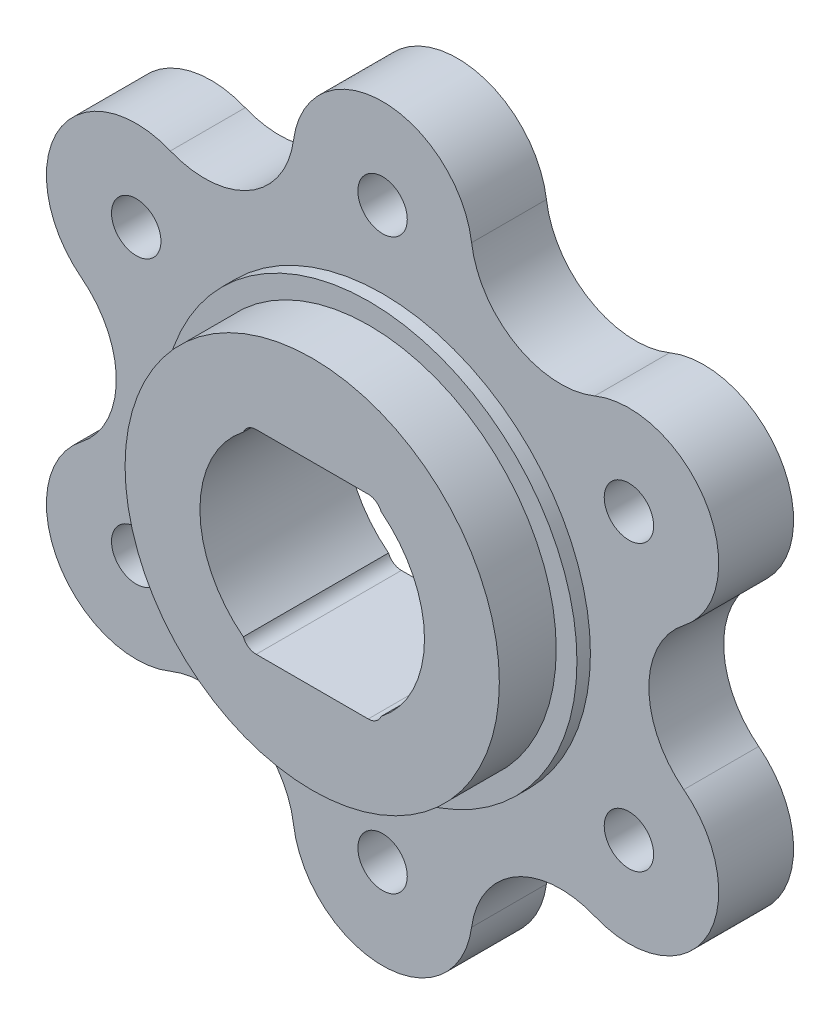
ISO-10303-21;
HEADER;
FILE_DESCRIPTION(('STEP AP214'),'2;1');
FILE_NAME('part.step','',(''),(''),'','','');
FILE_SCHEMA(('AUTOMOTIVE_DESIGN { 1 0 10303 214 1 1 1 1 }'));
ENDSEC;
DATA;
#1=APPLICATION_CONTEXT('core data for automotive mechanical design processes');
#2=APPLICATION_PROTOCOL_DEFINITION('international standard','automotive_design',2000,#1);
#3=PRODUCT_CONTEXT('',#1,'mechanical');
#4=PRODUCT('Part','Part','',(#3));
#5=PRODUCT_RELATED_PRODUCT_CATEGORY('part','',(#4));
#6=PRODUCT_DEFINITION_FORMATION('','',#4);
#7=PRODUCT_DEFINITION_CONTEXT('part definition',#1,'design');
#8=PRODUCT_DEFINITION('design','',#6,#7);
#9=PRODUCT_DEFINITION_SHAPE('','',#8);
#10=(LENGTH_UNIT() NAMED_UNIT(*) SI_UNIT(.MILLI.,.METRE.));
#11=(NAMED_UNIT(*) PLANE_ANGLE_UNIT() SI_UNIT($,.RADIAN.));
#12=(NAMED_UNIT(*) SI_UNIT($,.STERADIAN.) SOLID_ANGLE_UNIT());
#13=UNCERTAINTY_MEASURE_WITH_UNIT(LENGTH_MEASURE(1.E-05),#10,'distance_accuracy_value','');
#14=(GEOMETRIC_REPRESENTATION_CONTEXT(3) GLOBAL_UNCERTAINTY_ASSIGNED_CONTEXT((#13)) GLOBAL_UNIT_ASSIGNED_CONTEXT((#10,
#11,#12)) REPRESENTATION_CONTEXT('',''));
#15=CARTESIAN_POINT('',(0.,0.,0.));
#16=DIRECTION('',(0.,0.,1.));
#17=DIRECTION('',(1.,0.,0.));
#18=AXIS2_PLACEMENT_3D('',#15,#16,#17);
#19=CARTESIAN_POINT('',(-5.94648045530299,19.7996062748001,0.));
#20=DIRECTION('',(0.,0.,1.));
#21=DIRECTION('',(1.,0.,0.));
#22=AXIS2_PLACEMENT_3D('',#19,#20,#21);
#23=PLANE('',#22);
#24=CARTESIAN_POINT('',(16.4544826719043,9.5,0.));
#25=DIRECTION('',(0.,0.,-1.));
#26=DIRECTION('',(-1.,0.,0.));
#27=AXIS2_PLACEMENT_3D('',#24,#25,#26);
#28=CIRCLE('',#27,1.64999999999999);
#29=CARTESIAN_POINT('',(14.8044826719043,9.5,0.));
#30=VERTEX_POINT('',#29);
#31=EDGE_CURVE('E458',#30,#30,#28,.T.);
#32=ORIENTED_EDGE('',*,*,#31,.F.);
#33=EDGE_LOOP('',(#32));
#34=FACE_BOUND('',#33,.T.);
#35=CARTESIAN_POINT('',(0.,-19.,0.));
#36=DIRECTION('',(0.,0.,-1.));
#37=DIRECTION('',(-1.,0.,0.));
#38=AXIS2_PLACEMENT_3D('',#35,#36,#37);
#39=CIRCLE('',#38,1.64999999999999);
#40=CARTESIAN_POINT('',(-1.64999999999999,-19.,0.));
#41=VERTEX_POINT('',#40);
#42=EDGE_CURVE('E472',#41,#41,#39,.T.);
#43=ORIENTED_EDGE('',*,*,#42,.F.);
#44=EDGE_LOOP('',(#43));
#45=FACE_BOUND('',#44,.T.);
#46=CARTESIAN_POINT('',(-16.4544826719043,-9.50000000000001,0.));
#47=DIRECTION('',(0.,0.,-1.));
#48=DIRECTION('',(-1.,0.,0.));
#49=AXIS2_PLACEMENT_3D('',#46,#47,#48);
#50=CIRCLE('',#49,1.64999999999999);
#51=CARTESIAN_POINT('',(-18.1044826719043,-9.50000000000001,0.));
#52=VERTEX_POINT('',#51);
#53=EDGE_CURVE('E478',#52,#52,#50,.T.);
#54=ORIENTED_EDGE('',*,*,#53,.F.);
#55=EDGE_LOOP('',(#54));
#56=FACE_BOUND('',#55,.T.);
#57=CARTESIAN_POINT('',(0.,19.,0.));
#58=DIRECTION('',(0.,0.,1.));
#59=DIRECTION('',(1.,0.,0.));
#60=AXIS2_PLACEMENT_3D('',#57,#58,#59);
#61=CIRCLE('',#60,6.00000000000001);
#62=CARTESIAN_POINT('',(5.946480455303,19.7996062748001,0.));
#63=VERTEX_POINT('',#62);
#64=CARTESIAN_POINT('',(-5.94648045530299,19.7996062748001,0.));
#65=VERTEX_POINT('',#64);
#66=EDGE_CURVE('E240',#63,#65,#61,.T.);
#67=ORIENTED_EDGE('',*,*,#66,.F.);
#68=CARTESIAN_POINT('',(11.892960910606,20.5992125496001,0.));
#69=DIRECTION('',(0.,0.,1.));
#70=DIRECTION('',(1.,0.,0.));
#71=AXIS2_PLACEMENT_3D('',#68,#69,#70);
#72=CIRCLE('',#71,5.99999999999999);
#73=CARTESIAN_POINT('',(14.1737217912552,15.0496062748001,0.));
#74=VERTEX_POINT('',#73);
#75=EDGE_CURVE('E244',#63,#74,#72,.T.);
#76=ORIENTED_EDGE('',*,*,#75,.T.);
#77=CARTESIAN_POINT('',(16.4544826719043,9.5,0.));
#78=DIRECTION('',(0.,0.,1.));
#79=DIRECTION('',(1.,0.,0.));
#80=AXIS2_PLACEMENT_3D('',#77,#78,#79);
#81=CIRCLE('',#80,6.00000000000001);
#82=CARTESIAN_POINT('',(20.1202022465581,4.74999999999999,0.));
#83=VERTEX_POINT('',#82);
#84=EDGE_CURVE('E302',#83,#74,#81,.T.);
#85=ORIENTED_EDGE('',*,*,#84,.F.);
#86=CARTESIAN_POINT('',(23.7859218212119,0.,0.));
#87=DIRECTION('',(0.,0.,1.));
#88=DIRECTION('',(1.,0.,0.));
#89=AXIS2_PLACEMENT_3D('',#86,#87,#88);
#90=CIRCLE('',#89,5.99999999999999);
#91=CARTESIAN_POINT('',(20.1202022465582,-4.75,0.));
#92=VERTEX_POINT('',#91);
#93=EDGE_CURVE('E299',#83,#92,#90,.T.);
#94=ORIENTED_EDGE('',*,*,#93,.T.);
#95=CARTESIAN_POINT('',(16.4544826719043,-9.5,0.));
#96=DIRECTION('',(0.,0.,1.));
#97=DIRECTION('',(1.,0.,0.));
#98=AXIS2_PLACEMENT_3D('',#95,#96,#97);
#99=CIRCLE('',#98,6.00000000000001);
#100=CARTESIAN_POINT('',(14.1737217912551,-15.0496062748001,0.));
#101=VERTEX_POINT('',#100);
#102=EDGE_CURVE('E296',#101,#92,#99,.T.);
#103=ORIENTED_EDGE('',*,*,#102,.F.);
#104=CARTESIAN_POINT('',(11.892960910606,-20.5992125496001,0.));
#105=DIRECTION('',(0.,0.,1.));
#106=DIRECTION('',(1.,0.,0.));
#107=AXIS2_PLACEMENT_3D('',#104,#105,#106);
#108=CIRCLE('',#107,5.99999999999999);
#109=CARTESIAN_POINT('',(5.94648045530299,-19.7996062748001,0.));
#110=VERTEX_POINT('',#109);
#111=EDGE_CURVE('E293',#101,#110,#108,.T.);
#112=ORIENTED_EDGE('',*,*,#111,.T.);
#113=CARTESIAN_POINT('',(0.,-19.,0.));
#114=DIRECTION('',(0.,0.,1.));
#115=DIRECTION('',(1.,0.,0.));
#116=AXIS2_PLACEMENT_3D('',#113,#114,#115);
#117=CIRCLE('',#116,6.00000000000001);
#118=CARTESIAN_POINT('',(-5.94648045530299,-19.7996062748001,0.));
#119=VERTEX_POINT('',#118);
#120=EDGE_CURVE('E290',#119,#110,#117,.T.);
#121=ORIENTED_EDGE('',*,*,#120,.F.);
#122=CARTESIAN_POINT('',(-11.892960910606,-20.5992125496001,0.));
#123=DIRECTION('',(0.,0.,1.));
#124=DIRECTION('',(1.,0.,0.));
#125=AXIS2_PLACEMENT_3D('',#122,#123,#124);
#126=CIRCLE('',#125,5.99999999999999);
#127=CARTESIAN_POINT('',(-14.1737217912552,-15.0496062748001,0.));
#128=VERTEX_POINT('',#127);
#129=EDGE_CURVE('E287',#119,#128,#126,.T.);
#130=ORIENTED_EDGE('',*,*,#129,.T.);
#131=CARTESIAN_POINT('',(-16.4544826719043,-9.50000000000001,0.));
#132=DIRECTION('',(0.,0.,1.));
#133=DIRECTION('',(1.,0.,0.));
#134=AXIS2_PLACEMENT_3D('',#131,#132,#133);
#135=CIRCLE('',#134,6.00000000000001);
#136=CARTESIAN_POINT('',(-20.1202022465581,-4.75000000000001,0.));
#137=VERTEX_POINT('',#136);
#138=EDGE_CURVE('E284',#137,#128,#135,.T.);
#139=ORIENTED_EDGE('',*,*,#138,.F.);
#140=CARTESIAN_POINT('',(-23.7859218212119,0.,0.));
#141=DIRECTION('',(0.,0.,1.));
#142=DIRECTION('',(1.,0.,0.));
#143=AXIS2_PLACEMENT_3D('',#140,#141,#142);
#144=CIRCLE('',#143,5.99999999999999);
#145=CARTESIAN_POINT('',(-20.1202022465582,4.74999999999999,0.));
#146=VERTEX_POINT('',#145);
#147=EDGE_CURVE('E281',#137,#146,#144,.T.);
#148=ORIENTED_EDGE('',*,*,#147,.T.);
#149=CARTESIAN_POINT('',(-16.4544826719043,9.49999999999999,0.));
#150=DIRECTION('',(0.,0.,1.));
#151=DIRECTION('',(1.,0.,0.));
#152=AXIS2_PLACEMENT_3D('',#149,#150,#151);
#153=CIRCLE('',#152,6.00000000000001);
#154=CARTESIAN_POINT('',(-14.1737217912552,15.0496062748001,0.));
#155=VERTEX_POINT('',#154);
#156=EDGE_CURVE('E278',#155,#146,#153,.T.);
#157=ORIENTED_EDGE('',*,*,#156,.F.);
#158=CARTESIAN_POINT('',(-11.892960910606,20.5992125496001,0.));
#159=DIRECTION('',(0.,0.,1.));
#160=DIRECTION('',(1.,0.,0.));
#161=AXIS2_PLACEMENT_3D('',#158,#159,#160);
#162=CIRCLE('',#161,6.);
#163=EDGE_CURVE('E275',#155,#65,#162,.T.);
#164=ORIENTED_EDGE('',*,*,#163,.T.);
#165=EDGE_LOOP('',(#67,#76,#85,#94,#103,#112,#121,#130,#139,#148,#157,#164));
#166=FACE_BOUND('',#165,.T.);
#167=DIRECTION('',(1.,0.,0.));
#168=VECTOR('',#167,1.);
#169=CARTESIAN_POINT('',(-3.74165738677394,6.5,0.));
#170=LINE('',#169,#168);
#171=CARTESIAN_POINT('',(-3.74165738677394,6.5,0.));
#172=VERTEX_POINT('',#171);
#173=CARTESIAN_POINT('',(3.74165738677394,6.5,0.));
#174=VERTEX_POINT('',#173);
#175=EDGE_CURVE('E219',#172,#174,#170,.T.);
#176=ORIENTED_EDGE('',*,*,#175,.F.);
#177=CARTESIAN_POINT('',(-3.74165738677394,5.57022058030321,0.));
#178=DIRECTION('',(0.,0.,1.));
#179=DIRECTION('',(-1.,0.,0.));
#180=AXIS2_PLACEMENT_3D('',#177,#178,#179);
#181=CIRCLE('',#180,0.929779419696793);
#182=CARTESIAN_POINT('',(-4.60239320805239,5.92182208095391,0.));
#183=VERTEX_POINT('',#182);
#184=EDGE_CURVE('E63',#172,#183,#181,.T.);
#185=ORIENTED_EDGE('',*,*,#184,.T.);
#186=CARTESIAN_POINT('',(0.,0.,0.));
#187=DIRECTION('',(0.,0.,1.));
#188=DIRECTION('',(1.,0.,0.));
#189=AXIS2_PLACEMENT_3D('',#186,#187,#188);
#190=CIRCLE('',#189,7.5);
#191=CARTESIAN_POINT('',(-4.60239320805239,-5.92182208095391,0.));
#192=VERTEX_POINT('',#191);
#193=EDGE_CURVE('E210',#183,#192,#190,.T.);
#194=ORIENTED_EDGE('',*,*,#193,.T.);
#195=CARTESIAN_POINT('',(-3.74165738677394,-5.57022058030321,0.));
#196=DIRECTION('',(0.,0.,1.));
#197=DIRECTION('',(1.,0.,0.));
#198=AXIS2_PLACEMENT_3D('',#195,#196,#197);
#199=CIRCLE('',#198,0.929779419696793);
#200=CARTESIAN_POINT('',(-3.74165738677394,-6.5,0.));
#201=VERTEX_POINT('',#200);
#202=EDGE_CURVE('E498',#192,#201,#199,.T.);
#203=ORIENTED_EDGE('',*,*,#202,.T.);
#204=DIRECTION('',(-1.,0.,0.));
#205=VECTOR('',#204,1.);
#206=CARTESIAN_POINT('',(3.74165738677394,-6.5,0.));
#207=LINE('',#206,#205);
#208=CARTESIAN_POINT('',(3.74165738677394,-6.5,0.));
#209=VERTEX_POINT('',#208);
#210=EDGE_CURVE('E213',#209,#201,#207,.T.);
#211=ORIENTED_EDGE('',*,*,#210,.F.);
#212=CARTESIAN_POINT('',(3.74165738677394,-5.57022058030321,0.));
#213=DIRECTION('',(0.,0.,1.));
#214=DIRECTION('',(-1.,0.,0.));
#215=AXIS2_PLACEMENT_3D('',#212,#213,#214);
#216=CIRCLE('',#215,0.929779419696793);
#217=CARTESIAN_POINT('',(4.60239320805239,-5.92182208095391,0.));
#218=VERTEX_POINT('',#217);
#219=EDGE_CURVE('E198',#209,#218,#216,.T.);
#220=ORIENTED_EDGE('',*,*,#219,.T.);
#221=CARTESIAN_POINT('',(0.,0.,0.));
#222=DIRECTION('',(0.,0.,1.));
#223=DIRECTION('',(1.,0.,0.));
#224=AXIS2_PLACEMENT_3D('',#221,#222,#223);
#225=CIRCLE('',#224,7.5);
#226=CARTESIAN_POINT('',(4.60239320805239,5.92182208095391,0.));
#227=VERTEX_POINT('',#226);
#228=EDGE_CURVE('E217',#218,#227,#225,.T.);
#229=ORIENTED_EDGE('',*,*,#228,.T.);
#230=CARTESIAN_POINT('',(3.74165738677394,5.57022058030321,0.));
#231=DIRECTION('',(0.,0.,1.));
#232=DIRECTION('',(1.,0.,0.));
#233=AXIS2_PLACEMENT_3D('',#230,#231,#232);
#234=CIRCLE('',#233,0.929779419696793);
#235=EDGE_CURVE('E182',#227,#174,#234,.T.);
#236=ORIENTED_EDGE('',*,*,#235,.T.);
#237=EDGE_LOOP('',(#176,#185,#194,#203,#211,#220,#229,#236));
#238=FACE_BOUND('',#237,.T.);
#239=CARTESIAN_POINT('',(-16.4544826719043,9.49999999999999,0.));
#240=DIRECTION('',(0.,0.,-1.));
#241=DIRECTION('',(-1.,0.,0.));
#242=AXIS2_PLACEMENT_3D('',#239,#240,#241);
#243=CIRCLE('',#242,1.64999999999999);
#244=CARTESIAN_POINT('',(-18.1044826719043,9.49999999999999,0.));
#245=VERTEX_POINT('',#244);
#246=EDGE_CURVE('E445',#245,#245,#243,.T.);
#247=ORIENTED_EDGE('',*,*,#246,.F.);
#248=EDGE_LOOP('',(#247));
#249=FACE_BOUND('',#248,.T.);
#250=CARTESIAN_POINT('',(16.4544826719043,-9.5,0.));
#251=DIRECTION('',(0.,0.,-1.));
#252=DIRECTION('',(-1.,0.,0.));
#253=AXIS2_PLACEMENT_3D('',#250,#251,#252);
#254=CIRCLE('',#253,1.64999999999999);
#255=CARTESIAN_POINT('',(14.8044826719043,-9.5,0.));
#256=VERTEX_POINT('',#255);
#257=EDGE_CURVE('E449',#256,#256,#254,.T.);
#258=ORIENTED_EDGE('',*,*,#257,.F.);
#259=EDGE_LOOP('',(#258));
#260=FACE_BOUND('',#259,.T.);
#261=CARTESIAN_POINT('',(0.,19.,0.));
#262=DIRECTION('',(0.,0.,-1.));
#263=DIRECTION('',(-1.,0.,0.));
#264=AXIS2_PLACEMENT_3D('',#261,#262,#263);
#265=CIRCLE('',#264,1.64999999999999);
#266=CARTESIAN_POINT('',(-1.64999999999999,19.,0.));
#267=VERTEX_POINT('',#266);
#268=EDGE_CURVE('E452',#267,#267,#265,.T.);
#269=ORIENTED_EDGE('',*,*,#268,.F.);
#270=EDGE_LOOP('',(#269));
#271=FACE_BOUND('',#270,.T.);
#272=ADVANCED_FACE('F41',(#34,#45,#56,#166,#238,#249,#260,#271),#23,.F.);
#273=CARTESIAN_POINT('',(0.,0.,9.7));
#274=DIRECTION('',(0.,0.,1.));
#275=DIRECTION('',(1.,0.,0.));
#276=AXIS2_PLACEMENT_3D('',#273,#274,#275);
#277=PLANE('',#276);
#278=CARTESIAN_POINT('',(-3.74165738677394,5.57022058030321,9.7));
#279=DIRECTION('',(0.,0.,1.));
#280=DIRECTION('',(-1.,0.,0.));
#281=AXIS2_PLACEMENT_3D('',#278,#279,#280);
#282=CIRCLE('',#281,0.929779419696793);
#283=CARTESIAN_POINT('',(-3.74165738677394,6.5,9.7));
#284=VERTEX_POINT('',#283);
#285=CARTESIAN_POINT('',(-4.60239320805239,5.92182208095391,9.7));
#286=VERTEX_POINT('',#285);
#287=EDGE_CURVE('E493',#284,#286,#282,.T.);
#288=ORIENTED_EDGE('',*,*,#287,.F.);
#289=DIRECTION('',(1.,0.,0.));
#290=VECTOR('',#289,1.);
#291=CARTESIAN_POINT('',(-3.74165738677394,6.5,9.7));
#292=LINE('',#291,#290);
#293=CARTESIAN_POINT('',(3.74165738677394,6.5,9.7));
#294=VERTEX_POINT('',#293);
#295=EDGE_CURVE('E197',#284,#294,#292,.T.);
#296=ORIENTED_EDGE('',*,*,#295,.T.);
#297=CARTESIAN_POINT('',(3.74165738677394,5.57022058030321,9.7));
#298=DIRECTION('',(0.,0.,1.));
#299=DIRECTION('',(1.,0.,0.));
#300=AXIS2_PLACEMENT_3D('',#297,#298,#299);
#301=CIRCLE('',#300,0.929779419696793);
#302=CARTESIAN_POINT('',(4.60239320805239,5.92182208095391,9.7));
#303=VERTEX_POINT('',#302);
#304=EDGE_CURVE('E179',#303,#294,#301,.T.);
#305=ORIENTED_EDGE('',*,*,#304,.F.);
#306=CARTESIAN_POINT('',(0.,0.,9.7));
#307=DIRECTION('',(0.,0.,1.));
#308=DIRECTION('',(1.,0.,0.));
#309=AXIS2_PLACEMENT_3D('',#306,#307,#308);
#310=CIRCLE('',#309,7.5);
#311=CARTESIAN_POINT('',(4.60239320805239,-5.92182208095391,9.7));
#312=VERTEX_POINT('',#311);
#313=EDGE_CURVE('E195',#312,#303,#310,.T.);
#314=ORIENTED_EDGE('',*,*,#313,.F.);
#315=CARTESIAN_POINT('',(3.74165738677394,-5.57022058030321,9.7));
#316=DIRECTION('',(0.,0.,1.));
#317=DIRECTION('',(-1.,0.,0.));
#318=AXIS2_PLACEMENT_3D('',#315,#316,#317);
#319=CIRCLE('',#318,0.929779419696793);
#320=CARTESIAN_POINT('',(3.74165738677394,-6.5,9.7));
#321=VERTEX_POINT('',#320);
#322=EDGE_CURVE('E55',#321,#312,#319,.T.);
#323=ORIENTED_EDGE('',*,*,#322,.F.);
#324=DIRECTION('',(-1.,0.,0.));
#325=VECTOR('',#324,1.);
#326=CARTESIAN_POINT('',(3.74165738677394,-6.5,9.7));
#327=LINE('',#326,#325);
#328=CARTESIAN_POINT('',(-3.74165738677394,-6.5,9.7));
#329=VERTEX_POINT('',#328);
#330=EDGE_CURVE('E201',#321,#329,#327,.T.);
#331=ORIENTED_EDGE('',*,*,#330,.T.);
#332=CARTESIAN_POINT('',(-3.74165738677394,-5.57022058030321,9.7));
#333=DIRECTION('',(0.,0.,1.));
#334=DIRECTION('',(1.,0.,0.));
#335=AXIS2_PLACEMENT_3D('',#332,#333,#334);
#336=CIRCLE('',#335,0.929779419696793);
#337=CARTESIAN_POINT('',(-4.60239320805239,-5.92182208095391,9.7));
#338=VERTEX_POINT('',#337);
#339=EDGE_CURVE('E494',#338,#329,#336,.T.);
#340=ORIENTED_EDGE('',*,*,#339,.F.);
#341=CARTESIAN_POINT('',(0.,0.,9.7));
#342=DIRECTION('',(0.,0.,1.));
#343=DIRECTION('',(1.,0.,0.));
#344=AXIS2_PLACEMENT_3D('',#341,#342,#343);
#345=CIRCLE('',#344,7.5);
#346=EDGE_CURVE('E206',#286,#338,#345,.T.);
#347=ORIENTED_EDGE('',*,*,#346,.F.);
#348=EDGE_LOOP('',(#288,#296,#305,#314,#323,#331,#340,#347));
#349=FACE_BOUND('',#348,.T.);
#350=CARTESIAN_POINT('',(0.,0.,9.7));
#351=DIRECTION('',(0.,0.,1.));
#352=DIRECTION('',(1.,0.,0.));
#353=AXIS2_PLACEMENT_3D('',#350,#351,#352);
#354=CIRCLE('',#353,12.5);
#355=CARTESIAN_POINT('',(12.5,0.,9.7));
#356=VERTEX_POINT('',#355);
#357=EDGE_CURVE('E230',#356,#356,#354,.T.);
#358=ORIENTED_EDGE('',*,*,#357,.T.);
#359=EDGE_LOOP('',(#358));
#360=FACE_BOUND('',#359,.T.);
#361=ADVANCED_FACE('F193',(#349,#360),#277,.T.);
#362=CARTESIAN_POINT('',(0.,19.,5.));
#363=DIRECTION('',(0.,0.,-1.));
#364=DIRECTION('',(-1.,0.,0.));
#365=AXIS2_PLACEMENT_3D('',#362,#363,#364);
#366=CYLINDRICAL_SURFACE('',#365,6.00000000000001);
#367=ORIENTED_EDGE('',*,*,#66,.T.);
#368=DIRECTION('',(0.,0.,-1.));
#369=VECTOR('',#368,1.);
#370=CARTESIAN_POINT('',(-5.94648045530299,19.7996062748001,5.));
#371=LINE('',#370,#369);
#372=CARTESIAN_POINT('',(-5.94648045530299,19.7996062748001,5.));
#373=VERTEX_POINT('',#372);
#374=EDGE_CURVE('E49',#373,#65,#371,.T.);
#375=ORIENTED_EDGE('',*,*,#374,.F.);
#376=CARTESIAN_POINT('',(0.,19.,5.));
#377=DIRECTION('',(0.,0.,1.));
#378=DIRECTION('',(1.,0.,0.));
#379=AXIS2_PLACEMENT_3D('',#376,#377,#378);
#380=CIRCLE('',#379,6.00000000000001);
#381=CARTESIAN_POINT('',(5.946480455303,19.7996062748001,5.));
#382=VERTEX_POINT('',#381);
#383=EDGE_CURVE('E241',#382,#373,#380,.T.);
#384=ORIENTED_EDGE('',*,*,#383,.F.);
#385=DIRECTION('',(0.,0.,-1.));
#386=VECTOR('',#385,1.);
#387=CARTESIAN_POINT('',(5.946480455303,19.7996062748001,5.));
#388=LINE('',#387,#386);
#389=EDGE_CURVE('E272',#382,#63,#388,.T.);
#390=ORIENTED_EDGE('',*,*,#389,.T.);
#391=EDGE_LOOP('',(#367,#375,#384,#390));
#392=FACE_BOUND('',#391,.T.);
#393=ADVANCED_FACE('F43',(#392),#366,.T.);
#394=CARTESIAN_POINT('',(-11.892960910606,20.5992125496001,5.));
#395=DIRECTION('',(0.,0.,-1.));
#396=DIRECTION('',(-1.,0.,0.));
#397=AXIS2_PLACEMENT_3D('',#394,#395,#396);
#398=CYLINDRICAL_SURFACE('',#397,6.);
#399=ORIENTED_EDGE('',*,*,#163,.F.);
#400=DIRECTION('',(0.,0.,-1.));
#401=VECTOR('',#400,1.);
#402=CARTESIAN_POINT('',(-14.1737217912552,15.0496062748001,5.));
#403=LINE('',#402,#401);
#404=CARTESIAN_POINT('',(-14.1737217912552,15.0496062748001,5.));
#405=VERTEX_POINT('',#404);
#406=EDGE_CURVE('E326',#405,#155,#403,.T.);
#407=ORIENTED_EDGE('',*,*,#406,.F.);
#408=CARTESIAN_POINT('',(-11.892960910606,20.5992125496001,5.));
#409=DIRECTION('',(0.,0.,1.));
#410=DIRECTION('',(1.,0.,0.));
#411=AXIS2_PLACEMENT_3D('',#408,#409,#410);
#412=CIRCLE('',#411,6.);
#413=EDGE_CURVE('E243',#405,#373,#412,.T.);
#414=ORIENTED_EDGE('',*,*,#413,.T.);
#415=ORIENTED_EDGE('',*,*,#374,.T.);
#416=EDGE_LOOP('',(#399,#407,#414,#415));
#417=FACE_BOUND('',#416,.T.);
#418=ADVANCED_FACE('F347',(#417),#398,.F.);
#419=CARTESIAN_POINT('',(-16.4544826719043,9.49999999999999,5.));
#420=DIRECTION('',(0.,0.,-1.));
#421=DIRECTION('',(-1.,0.,0.));
#422=AXIS2_PLACEMENT_3D('',#419,#420,#421);
#423=CYLINDRICAL_SURFACE('',#422,6.00000000000001);
#424=ORIENTED_EDGE('',*,*,#156,.T.);
#425=DIRECTION('',(0.,0.,-1.));
#426=VECTOR('',#425,1.);
#427=CARTESIAN_POINT('',(-20.1202022465582,4.74999999999999,5.));
#428=LINE('',#427,#426);
#429=CARTESIAN_POINT('',(-20.1202022465582,4.74999999999999,5.));
#430=VERTEX_POINT('',#429);
#431=EDGE_CURVE('E324',#430,#146,#428,.T.);
#432=ORIENTED_EDGE('',*,*,#431,.F.);
#433=CARTESIAN_POINT('',(-16.4544826719043,9.49999999999999,5.));
#434=DIRECTION('',(0.,0.,1.));
#435=DIRECTION('',(1.,0.,0.));
#436=AXIS2_PLACEMENT_3D('',#433,#434,#435);
#437=CIRCLE('',#436,6.00000000000001);
#438=EDGE_CURVE('E247',#405,#430,#437,.T.);
#439=ORIENTED_EDGE('',*,*,#438,.F.);
#440=ORIENTED_EDGE('',*,*,#406,.T.);
#441=EDGE_LOOP('',(#424,#432,#439,#440));
#442=FACE_BOUND('',#441,.T.);
#443=ADVANCED_FACE('F399',(#442),#423,.T.);
#444=CARTESIAN_POINT('',(-23.7859218212119,0.,5.));
#445=DIRECTION('',(0.,0.,-1.));
#446=DIRECTION('',(-1.,0.,0.));
#447=AXIS2_PLACEMENT_3D('',#444,#445,#446);
#448=CYLINDRICAL_SURFACE('',#447,5.99999999999999);
#449=ORIENTED_EDGE('',*,*,#147,.F.);
#450=DIRECTION('',(0.,0.,-1.));
#451=VECTOR('',#450,1.);
#452=CARTESIAN_POINT('',(-20.1202022465581,-4.75000000000001,5.));
#453=LINE('',#452,#451);
#454=CARTESIAN_POINT('',(-20.1202022465581,-4.75000000000001,5.));
#455=VERTEX_POINT('',#454);
#456=EDGE_CURVE('E322',#455,#137,#453,.T.);
#457=ORIENTED_EDGE('',*,*,#456,.F.);
#458=CARTESIAN_POINT('',(-23.7859218212119,0.,5.));
#459=DIRECTION('',(0.,0.,1.));
#460=DIRECTION('',(1.,0.,0.));
#461=AXIS2_PLACEMENT_3D('',#458,#459,#460);
#462=CIRCLE('',#461,5.99999999999999);
#463=EDGE_CURVE('E249',#455,#430,#462,.T.);
#464=ORIENTED_EDGE('',*,*,#463,.T.);
#465=ORIENTED_EDGE('',*,*,#431,.T.);
#466=EDGE_LOOP('',(#449,#457,#464,#465));
#467=FACE_BOUND('',#466,.T.);
#468=ADVANCED_FACE('F395',(#467),#448,.F.);
#469=CARTESIAN_POINT('',(-16.4544826719043,-9.50000000000001,5.));
#470=DIRECTION('',(0.,0.,-1.));
#471=DIRECTION('',(-1.,0.,0.));
#472=AXIS2_PLACEMENT_3D('',#469,#470,#471);
#473=CYLINDRICAL_SURFACE('',#472,6.00000000000001);
#474=ORIENTED_EDGE('',*,*,#138,.T.);
#475=DIRECTION('',(0.,0.,-1.));
#476=VECTOR('',#475,1.);
#477=CARTESIAN_POINT('',(-14.1737217912552,-15.0496062748001,5.));
#478=LINE('',#477,#476);
#479=CARTESIAN_POINT('',(-14.1737217912552,-15.0496062748001,5.));
#480=VERTEX_POINT('',#479);
#481=EDGE_CURVE('E320',#480,#128,#478,.T.);
#482=ORIENTED_EDGE('',*,*,#481,.F.);
#483=CARTESIAN_POINT('',(-16.4544826719043,-9.50000000000001,5.));
#484=DIRECTION('',(0.,0.,1.));
#485=DIRECTION('',(1.,0.,0.));
#486=AXIS2_PLACEMENT_3D('',#483,#484,#485);
#487=CIRCLE('',#486,6.00000000000001);
#488=EDGE_CURVE('E252',#455,#480,#487,.T.);
#489=ORIENTED_EDGE('',*,*,#488,.F.);
#490=ORIENTED_EDGE('',*,*,#456,.T.);
#491=EDGE_LOOP('',(#474,#482,#489,#490));
#492=FACE_BOUND('',#491,.T.);
#493=ADVANCED_FACE('F391',(#492),#473,.T.);
#494=CARTESIAN_POINT('',(-11.892960910606,-20.5992125496001,5.));
#495=DIRECTION('',(0.,0.,-1.));
#496=DIRECTION('',(-1.,0.,0.));
#497=AXIS2_PLACEMENT_3D('',#494,#495,#496);
#498=CYLINDRICAL_SURFACE('',#497,5.99999999999999);
#499=ORIENTED_EDGE('',*,*,#129,.F.);
#500=DIRECTION('',(0.,0.,-1.));
#501=VECTOR('',#500,1.);
#502=CARTESIAN_POINT('',(-5.94648045530299,-19.7996062748001,5.));
#503=LINE('',#502,#501);
#504=CARTESIAN_POINT('',(-5.94648045530299,-19.7996062748001,5.));
#505=VERTEX_POINT('',#504);
#506=EDGE_CURVE('E318',#505,#119,#503,.T.);
#507=ORIENTED_EDGE('',*,*,#506,.F.);
#508=CARTESIAN_POINT('',(-11.892960910606,-20.5992125496001,5.));
#509=DIRECTION('',(0.,0.,1.));
#510=DIRECTION('',(1.,0.,0.));
#511=AXIS2_PLACEMENT_3D('',#508,#509,#510);
#512=CIRCLE('',#511,5.99999999999999);
#513=EDGE_CURVE('E254',#505,#480,#512,.T.);
#514=ORIENTED_EDGE('',*,*,#513,.T.);
#515=ORIENTED_EDGE('',*,*,#481,.T.);
#516=EDGE_LOOP('',(#499,#507,#514,#515));
#517=FACE_BOUND('',#516,.T.);
#518=ADVANCED_FACE('F387',(#517),#498,.F.);
#519=CARTESIAN_POINT('',(0.,-19.,5.));
#520=DIRECTION('',(0.,0.,-1.));
#521=DIRECTION('',(-1.,0.,0.));
#522=AXIS2_PLACEMENT_3D('',#519,#520,#521);
#523=CYLINDRICAL_SURFACE('',#522,6.00000000000001);
#524=ORIENTED_EDGE('',*,*,#120,.T.);
#525=DIRECTION('',(0.,0.,-1.));
#526=VECTOR('',#525,1.);
#527=CARTESIAN_POINT('',(5.94648045530299,-19.7996062748001,5.));
#528=LINE('',#527,#526);
#529=CARTESIAN_POINT('',(5.94648045530299,-19.7996062748001,5.));
#530=VERTEX_POINT('',#529);
#531=EDGE_CURVE('E316',#530,#110,#528,.T.);
#532=ORIENTED_EDGE('',*,*,#531,.F.);
#533=CARTESIAN_POINT('',(0.,-19.,5.));
#534=DIRECTION('',(0.,0.,1.));
#535=DIRECTION('',(1.,0.,0.));
#536=AXIS2_PLACEMENT_3D('',#533,#534,#535);
#537=CIRCLE('',#536,6.00000000000001);
#538=EDGE_CURVE('E257',#505,#530,#537,.T.);
#539=ORIENTED_EDGE('',*,*,#538,.F.);
#540=ORIENTED_EDGE('',*,*,#506,.T.);
#541=EDGE_LOOP('',(#524,#532,#539,#540));
#542=FACE_BOUND('',#541,.T.);
#543=ADVANCED_FACE('F383',(#542),#523,.T.);
#544=CARTESIAN_POINT('',(11.892960910606,-20.5992125496001,5.));
#545=DIRECTION('',(0.,0.,-1.));
#546=DIRECTION('',(-1.,0.,0.));
#547=AXIS2_PLACEMENT_3D('',#544,#545,#546);
#548=CYLINDRICAL_SURFACE('',#547,5.99999999999999);
#549=ORIENTED_EDGE('',*,*,#111,.F.);
#550=DIRECTION('',(0.,0.,-1.));
#551=VECTOR('',#550,1.);
#552=CARTESIAN_POINT('',(14.1737217912551,-15.0496062748001,5.));
#553=LINE('',#552,#551);
#554=CARTESIAN_POINT('',(14.1737217912551,-15.0496062748001,5.));
#555=VERTEX_POINT('',#554);
#556=EDGE_CURVE('E314',#555,#101,#553,.T.);
#557=ORIENTED_EDGE('',*,*,#556,.F.);
#558=CARTESIAN_POINT('',(11.892960910606,-20.5992125496001,5.));
#559=DIRECTION('',(0.,0.,1.));
#560=DIRECTION('',(1.,0.,0.));
#561=AXIS2_PLACEMENT_3D('',#558,#559,#560);
#562=CIRCLE('',#561,5.99999999999999);
#563=EDGE_CURVE('E259',#555,#530,#562,.T.);
#564=ORIENTED_EDGE('',*,*,#563,.T.);
#565=ORIENTED_EDGE('',*,*,#531,.T.);
#566=EDGE_LOOP('',(#549,#557,#564,#565));
#567=FACE_BOUND('',#566,.T.);
#568=ADVANCED_FACE('F379',(#567),#548,.F.);
#569=CARTESIAN_POINT('',(16.4544826719043,-9.5,5.));
#570=DIRECTION('',(0.,0.,-1.));
#571=DIRECTION('',(-1.,0.,0.));
#572=AXIS2_PLACEMENT_3D('',#569,#570,#571);
#573=CYLINDRICAL_SURFACE('',#572,6.00000000000001);
#574=ORIENTED_EDGE('',*,*,#102,.T.);
#575=DIRECTION('',(0.,0.,-1.));
#576=VECTOR('',#575,1.);
#577=CARTESIAN_POINT('',(20.1202022465582,-4.75,5.));
#578=LINE('',#577,#576);
#579=CARTESIAN_POINT('',(20.1202022465582,-4.75,5.));
#580=VERTEX_POINT('',#579);
#581=EDGE_CURVE('E312',#580,#92,#578,.T.);
#582=ORIENTED_EDGE('',*,*,#581,.F.);
#583=CARTESIAN_POINT('',(16.4544826719043,-9.5,5.));
#584=DIRECTION('',(0.,0.,1.));
#585=DIRECTION('',(1.,0.,0.));
#586=AXIS2_PLACEMENT_3D('',#583,#584,#585);
#587=CIRCLE('',#586,6.00000000000001);
#588=EDGE_CURVE('E262',#555,#580,#587,.T.);
#589=ORIENTED_EDGE('',*,*,#588,.F.);
#590=ORIENTED_EDGE('',*,*,#556,.T.);
#591=EDGE_LOOP('',(#574,#582,#589,#590));
#592=FACE_BOUND('',#591,.T.);
#593=ADVANCED_FACE('F375',(#592),#573,.T.);
#594=CARTESIAN_POINT('',(23.7859218212119,0.,5.));
#595=DIRECTION('',(0.,0.,-1.));
#596=DIRECTION('',(-1.,0.,0.));
#597=AXIS2_PLACEMENT_3D('',#594,#595,#596);
#598=CYLINDRICAL_SURFACE('',#597,5.99999999999999);
#599=ORIENTED_EDGE('',*,*,#93,.F.);
#600=DIRECTION('',(0.,0.,-1.));
#601=VECTOR('',#600,1.);
#602=CARTESIAN_POINT('',(20.1202022465581,4.74999999999999,5.));
#603=LINE('',#602,#601);
#604=CARTESIAN_POINT('',(20.1202022465581,4.74999999999999,5.));
#605=VERTEX_POINT('',#604);
#606=EDGE_CURVE('E310',#605,#83,#603,.T.);
#607=ORIENTED_EDGE('',*,*,#606,.F.);
#608=CARTESIAN_POINT('',(23.7859218212119,0.,5.));
#609=DIRECTION('',(0.,0.,1.));
#610=DIRECTION('',(1.,0.,0.));
#611=AXIS2_PLACEMENT_3D('',#608,#609,#610);
#612=CIRCLE('',#611,5.99999999999999);
#613=EDGE_CURVE('E264',#605,#580,#612,.T.);
#614=ORIENTED_EDGE('',*,*,#613,.T.);
#615=ORIENTED_EDGE('',*,*,#581,.T.);
#616=EDGE_LOOP('',(#599,#607,#614,#615));
#617=FACE_BOUND('',#616,.T.);
#618=ADVANCED_FACE('F371',(#617),#598,.F.);
#619=CARTESIAN_POINT('',(16.4544826719043,9.5,5.));
#620=DIRECTION('',(0.,0.,-1.));
#621=DIRECTION('',(-1.,0.,0.));
#622=AXIS2_PLACEMENT_3D('',#619,#620,#621);
#623=CYLINDRICAL_SURFACE('',#622,6.00000000000001);
#624=ORIENTED_EDGE('',*,*,#84,.T.);
#625=DIRECTION('',(0.,0.,-1.));
#626=VECTOR('',#625,1.);
#627=CARTESIAN_POINT('',(14.1737217912552,15.0496062748001,5.));
#628=LINE('',#627,#626);
#629=CARTESIAN_POINT('',(14.1737217912552,15.0496062748001,5.));
#630=VERTEX_POINT('',#629);
#631=EDGE_CURVE('E308',#630,#74,#628,.T.);
#632=ORIENTED_EDGE('',*,*,#631,.F.);
#633=CARTESIAN_POINT('',(16.4544826719043,9.5,5.));
#634=DIRECTION('',(0.,0.,1.));
#635=DIRECTION('',(1.,0.,0.));
#636=AXIS2_PLACEMENT_3D('',#633,#634,#635);
#637=CIRCLE('',#636,6.00000000000001);
#638=EDGE_CURVE('E267',#605,#630,#637,.T.);
#639=ORIENTED_EDGE('',*,*,#638,.F.);
#640=ORIENTED_EDGE('',*,*,#606,.T.);
#641=EDGE_LOOP('',(#624,#632,#639,#640));
#642=FACE_BOUND('',#641,.T.);
#643=ADVANCED_FACE('F367',(#642),#623,.T.);
#644=CARTESIAN_POINT('',(11.892960910606,20.5992125496001,5.));
#645=DIRECTION('',(0.,0.,-1.));
#646=DIRECTION('',(-1.,0.,0.));
#647=AXIS2_PLACEMENT_3D('',#644,#645,#646);
#648=CYLINDRICAL_SURFACE('',#647,5.99999999999999);
#649=ORIENTED_EDGE('',*,*,#75,.F.);
#650=ORIENTED_EDGE('',*,*,#389,.F.);
#651=CARTESIAN_POINT('',(11.892960910606,20.5992125496001,5.));
#652=DIRECTION('',(0.,0.,1.));
#653=DIRECTION('',(1.,0.,0.));
#654=AXIS2_PLACEMENT_3D('',#651,#652,#653);
#655=CIRCLE('',#654,5.99999999999999);
#656=EDGE_CURVE('E269',#382,#630,#655,.T.);
#657=ORIENTED_EDGE('',*,*,#656,.T.);
#658=ORIENTED_EDGE('',*,*,#631,.T.);
#659=EDGE_LOOP('',(#649,#650,#657,#658));
#660=FACE_BOUND('',#659,.T.);
#661=ADVANCED_FACE('F362',(#660),#648,.F.);
#662=CARTESIAN_POINT('',(-5.94648045530299,19.7996062748001,5.));
#663=DIRECTION('',(0.,0.,1.));
#664=DIRECTION('',(1.,0.,0.));
#665=AXIS2_PLACEMENT_3D('',#662,#663,#664);
#666=PLANE('',#665);
#667=CARTESIAN_POINT('',(0.,19.,5.));
#668=DIRECTION('',(0.,0.,1.));
#669=DIRECTION('',(1.,0.,0.));
#670=AXIS2_PLACEMENT_3D('',#667,#668,#669);
#671=CIRCLE('',#670,1.64999999999999);
#672=CARTESIAN_POINT('',(1.64999999999999,19.,5.));
#673=VERTEX_POINT('',#672);
#674=EDGE_CURVE('E454',#673,#673,#671,.T.);
#675=ORIENTED_EDGE('',*,*,#674,.F.);
#676=EDGE_LOOP('',(#675));
#677=FACE_BOUND('',#676,.T.);
#678=CARTESIAN_POINT('',(16.4544826719043,9.5,5.));
#679=DIRECTION('',(0.,0.,1.));
#680=DIRECTION('',(1.,0.,0.));
#681=AXIS2_PLACEMENT_3D('',#678,#679,#680);
#682=CIRCLE('',#681,1.64999999999999);
#683=CARTESIAN_POINT('',(18.1044826719043,9.5,5.));
#684=VERTEX_POINT('',#683);
#685=EDGE_CURVE('E465',#684,#684,#682,.T.);
#686=ORIENTED_EDGE('',*,*,#685,.F.);
#687=EDGE_LOOP('',(#686));
#688=FACE_BOUND('',#687,.T.);
#689=CARTESIAN_POINT('',(16.4544826719043,-9.5,5.));
#690=DIRECTION('',(0.,0.,1.));
#691=DIRECTION('',(1.,0.,0.));
#692=AXIS2_PLACEMENT_3D('',#689,#690,#691);
#693=CIRCLE('',#692,1.64999999999999);
#694=CARTESIAN_POINT('',(18.1044826719043,-9.5,5.));
#695=VERTEX_POINT('',#694);
#696=EDGE_CURVE('E469',#695,#695,#693,.T.);
#697=ORIENTED_EDGE('',*,*,#696,.F.);
#698=EDGE_LOOP('',(#697));
#699=FACE_BOUND('',#698,.T.);
#700=CARTESIAN_POINT('',(0.,-19.,5.));
#701=DIRECTION('',(0.,0.,1.));
#702=DIRECTION('',(1.,0.,0.));
#703=AXIS2_PLACEMENT_3D('',#700,#701,#702);
#704=CIRCLE('',#703,1.64999999999999);
#705=CARTESIAN_POINT('',(1.65,-19.,5.));
#706=VERTEX_POINT('',#705);
#707=EDGE_CURVE('E475',#706,#706,#704,.T.);
#708=ORIENTED_EDGE('',*,*,#707,.F.);
#709=EDGE_LOOP('',(#708));
#710=FACE_BOUND('',#709,.T.);
#711=CARTESIAN_POINT('',(-16.4544826719043,-9.50000000000001,5.));
#712=DIRECTION('',(0.,0.,1.));
#713=DIRECTION('',(1.,0.,0.));
#714=AXIS2_PLACEMENT_3D('',#711,#712,#713);
#715=CIRCLE('',#714,1.64999999999999);
#716=CARTESIAN_POINT('',(-14.8044826719043,-9.50000000000001,5.));
#717=VERTEX_POINT('',#716);
#718=EDGE_CURVE('E481',#717,#717,#715,.T.);
#719=ORIENTED_EDGE('',*,*,#718,.F.);
#720=EDGE_LOOP('',(#719));
#721=FACE_BOUND('',#720,.T.);
#722=CARTESIAN_POINT('',(-16.4544826719043,9.49999999999999,5.));
#723=DIRECTION('',(0.,0.,1.));
#724=DIRECTION('',(1.,0.,0.));
#725=AXIS2_PLACEMENT_3D('',#722,#723,#724);
#726=CIRCLE('',#725,1.64999999999999);
#727=CARTESIAN_POINT('',(-14.8044826719043,9.49999999999999,5.));
#728=VERTEX_POINT('',#727);
#729=EDGE_CURVE('E214',#728,#728,#726,.T.);
#730=ORIENTED_EDGE('',*,*,#729,.F.);
#731=EDGE_LOOP('',(#730));
#732=FACE_BOUND('',#731,.T.);
#733=CARTESIAN_POINT('',(0.,0.,5.));
#734=DIRECTION('',(0.,0.,1.));
#735=DIRECTION('',(1.,0.,0.));
#736=AXIS2_PLACEMENT_3D('',#733,#734,#735);
#737=CIRCLE('',#736,13.883);
#738=CARTESIAN_POINT('',(13.883,0.,5.));
#739=VERTEX_POINT('',#738);
#740=EDGE_CURVE('E237',#739,#739,#737,.F.);
#741=ORIENTED_EDGE('',*,*,#740,.T.);
#742=EDGE_LOOP('',(#741));
#743=FACE_BOUND('',#742,.T.);
#744=ORIENTED_EDGE('',*,*,#383,.T.);
#745=ORIENTED_EDGE('',*,*,#413,.F.);
#746=ORIENTED_EDGE('',*,*,#438,.T.);
#747=ORIENTED_EDGE('',*,*,#463,.F.);
#748=ORIENTED_EDGE('',*,*,#488,.T.);
#749=ORIENTED_EDGE('',*,*,#513,.F.);
#750=ORIENTED_EDGE('',*,*,#538,.T.);
#751=ORIENTED_EDGE('',*,*,#563,.F.);
#752=ORIENTED_EDGE('',*,*,#588,.T.);
#753=ORIENTED_EDGE('',*,*,#613,.F.);
#754=ORIENTED_EDGE('',*,*,#638,.T.);
#755=ORIENTED_EDGE('',*,*,#656,.F.);
#756=EDGE_LOOP('',(#744,#745,#746,#747,#748,#749,#750,#751,#752,#753,#754,#755));
#757=FACE_BOUND('',#756,.T.);
#758=ADVANCED_FACE('F359',(#677,#688,#699,#710,#721,#732,#743,#757),#666,.T.);
#759=CARTESIAN_POINT('',(0.,0.,5.9));
#760=DIRECTION('',(0.,0.,-1.));
#761=DIRECTION('',(-1.,0.,0.));
#762=AXIS2_PLACEMENT_3D('',#759,#760,#761);
#763=CYLINDRICAL_SURFACE('',#762,13.883);
#764=ORIENTED_EDGE('',*,*,#740,.F.);
#765=EDGE_LOOP('',(#764));
#766=FACE_BOUND('',#765,.T.);
#767=CARTESIAN_POINT('',(0.,0.,5.9));
#768=DIRECTION('',(0.,0.,1.));
#769=DIRECTION('',(1.,0.,0.));
#770=AXIS2_PLACEMENT_3D('',#767,#768,#769);
#771=CIRCLE('',#770,13.883);
#772=CARTESIAN_POINT('',(13.883,0.,5.9));
#773=VERTEX_POINT('',#772);
#774=EDGE_CURVE('E234',#773,#773,#771,.T.);
#775=ORIENTED_EDGE('',*,*,#774,.F.);
#776=EDGE_LOOP('',(#775));
#777=FACE_BOUND('',#776,.T.);
#778=ADVANCED_FACE('F356',(#766,#777),#763,.T.);
#779=CARTESIAN_POINT('',(0.,0.,5.9));
#780=DIRECTION('',(0.,0.,1.));
#781=DIRECTION('',(1.,0.,0.));
#782=AXIS2_PLACEMENT_3D('',#779,#780,#781);
#783=PLANE('',#782);
#784=CARTESIAN_POINT('',(0.,0.,5.9));
#785=DIRECTION('',(0.,0.,1.));
#786=DIRECTION('',(1.,0.,0.));
#787=AXIS2_PLACEMENT_3D('',#784,#785,#786);
#788=CIRCLE('',#787,12.5);
#789=CARTESIAN_POINT('',(12.5,0.,5.9));
#790=VERTEX_POINT('',#789);
#791=EDGE_CURVE('E233',#790,#790,#788,.F.);
#792=ORIENTED_EDGE('',*,*,#791,.T.);
#793=EDGE_LOOP('',(#792));
#794=FACE_BOUND('',#793,.T.);
#795=ORIENTED_EDGE('',*,*,#774,.T.);
#796=EDGE_LOOP('',(#795));
#797=FACE_BOUND('',#796,.T.);
#798=ADVANCED_FACE('F331',(#794,#797),#783,.T.);
#799=CARTESIAN_POINT('',(0.,0.,9.7));
#800=DIRECTION('',(0.,0.,-1.));
#801=DIRECTION('',(-1.,0.,0.));
#802=AXIS2_PLACEMENT_3D('',#799,#800,#801);
#803=CYLINDRICAL_SURFACE('',#802,12.5);
#804=ORIENTED_EDGE('',*,*,#791,.F.);
#805=EDGE_LOOP('',(#804));
#806=FACE_BOUND('',#805,.T.);
#807=ORIENTED_EDGE('',*,*,#357,.F.);
#808=EDGE_LOOP('',(#807));
#809=FACE_BOUND('',#808,.T.);
#810=ADVANCED_FACE('F334',(#806,#809),#803,.T.);
#811=CARTESIAN_POINT('',(0.,0.,9.7));
#812=DIRECTION('',(0.,0.,-1.));
#813=DIRECTION('',(-1.,0.,0.));
#814=AXIS2_PLACEMENT_3D('',#811,#812,#813);
#815=CYLINDRICAL_SURFACE('',#814,7.5);
#816=DIRECTION('',(0.,0.,1.));
#817=VECTOR('',#816,1.);
#818=CARTESIAN_POINT('',(-4.60239320805239,5.92182208095391,4.85));
#819=LINE('',#818,#817);
#820=EDGE_CURVE('E187',#286,#183,#819,.F.);
#821=ORIENTED_EDGE('',*,*,#820,.F.);
#822=ORIENTED_EDGE('',*,*,#346,.T.);
#823=DIRECTION('',(0.,0.,1.));
#824=VECTOR('',#823,1.);
#825=CARTESIAN_POINT('',(-4.60239320805239,-5.92182208095391,4.85));
#826=LINE('',#825,#824);
#827=EDGE_CURVE('E455',#192,#338,#826,.T.);
#828=ORIENTED_EDGE('',*,*,#827,.F.);
#829=ORIENTED_EDGE('',*,*,#193,.F.);
#830=EDGE_LOOP('',(#821,#822,#828,#829));
#831=FACE_BOUND('',#830,.T.);
#832=ADVANCED_FACE('F337',(#831),#815,.F.);
#833=CARTESIAN_POINT('',(3.74165738677394,-6.5,9.7));
#834=DIRECTION('',(0.,-1.,0.));
#835=DIRECTION('',(0.,0.,-1.));
#836=AXIS2_PLACEMENT_3D('',#833,#834,#835);
#837=PLANE('',#836);
#838=ORIENTED_EDGE('',*,*,#210,.T.);
#839=DIRECTION('',(0.,0.,-1.));
#840=VECTOR('',#839,1.);
#841=CARTESIAN_POINT('',(-3.74165738677394,-6.5,9.7));
#842=LINE('',#841,#840);
#843=EDGE_CURVE('E228',#329,#201,#842,.T.);
#844=ORIENTED_EDGE('',*,*,#843,.F.);
#845=ORIENTED_EDGE('',*,*,#330,.F.);
#846=DIRECTION('',(0.,0.,-1.));
#847=VECTOR('',#846,1.);
#848=CARTESIAN_POINT('',(3.74165738677394,-6.5,9.7));
#849=LINE('',#848,#847);
#850=EDGE_CURVE('E225',#321,#209,#849,.T.);
#851=ORIENTED_EDGE('',*,*,#850,.T.);
#852=EDGE_LOOP('',(#838,#844,#845,#851));
#853=FACE_BOUND('',#852,.T.);
#854=ADVANCED_FACE('F510',(#853),#837,.F.);
#855=CARTESIAN_POINT('',(0.,0.,9.7));
#856=DIRECTION('',(0.,0.,-1.));
#857=DIRECTION('',(-1.,0.,0.));
#858=AXIS2_PLACEMENT_3D('',#855,#856,#857);
#859=CYLINDRICAL_SURFACE('',#858,7.5);
#860=DIRECTION('',(0.,0.,1.));
#861=VECTOR('',#860,1.);
#862=CARTESIAN_POINT('',(4.60239320805239,-5.92182208095391,4.85));
#863=LINE('',#862,#861);
#864=EDGE_CURVE('E11',#312,#218,#863,.F.);
#865=ORIENTED_EDGE('',*,*,#864,.F.);
#866=ORIENTED_EDGE('',*,*,#313,.T.);
#867=DIRECTION('',(0.,0.,1.));
#868=VECTOR('',#867,1.);
#869=CARTESIAN_POINT('',(4.60239320805239,5.92182208095391,4.85));
#870=LINE('',#869,#868);
#871=EDGE_CURVE('E176',#227,#303,#870,.T.);
#872=ORIENTED_EDGE('',*,*,#871,.F.);
#873=ORIENTED_EDGE('',*,*,#228,.F.);
#874=EDGE_LOOP('',(#865,#866,#872,#873));
#875=FACE_BOUND('',#874,.T.);
#876=ADVANCED_FACE('F200',(#875),#859,.F.);
#877=CARTESIAN_POINT('',(-3.74165738677394,6.5,9.7));
#878=DIRECTION('',(0.,1.,0.));
#879=DIRECTION('',(0.,0.,1.));
#880=AXIS2_PLACEMENT_3D('',#877,#878,#879);
#881=PLANE('',#880);
#882=ORIENTED_EDGE('',*,*,#175,.T.);
#883=DIRECTION('',(0.,0.,-1.));
#884=VECTOR('',#883,1.);
#885=CARTESIAN_POINT('',(3.74165738677394,6.5,9.7));
#886=LINE('',#885,#884);
#887=EDGE_CURVE('E223',#294,#174,#886,.T.);
#888=ORIENTED_EDGE('',*,*,#887,.F.);
#889=ORIENTED_EDGE('',*,*,#295,.F.);
#890=DIRECTION('',(0.,0.,-1.));
#891=VECTOR('',#890,1.);
#892=CARTESIAN_POINT('',(-3.74165738677394,6.5,9.7));
#893=LINE('',#892,#891);
#894=EDGE_CURVE('E203',#284,#172,#893,.T.);
#895=ORIENTED_EDGE('',*,*,#894,.T.);
#896=EDGE_LOOP('',(#882,#888,#889,#895));
#897=FACE_BOUND('',#896,.T.);
#898=ADVANCED_FACE('F514',(#897),#881,.F.);
#899=CARTESIAN_POINT('',(-16.4544826719043,9.49999999999999,0.));
#900=DIRECTION('',(0.,0.,-1.));
#901=DIRECTION('',(-1.,0.,0.));
#902=AXIS2_PLACEMENT_3D('',#899,#900,#901);
#903=CYLINDRICAL_SURFACE('',#902,1.64999999999999);
#904=ORIENTED_EDGE('',*,*,#729,.T.);
#905=EDGE_LOOP('',(#904));
#906=FACE_BOUND('',#905,.T.);
#907=ORIENTED_EDGE('',*,*,#246,.T.);
#908=EDGE_LOOP('',(#907));
#909=FACE_BOUND('',#908,.T.);
#910=ADVANCED_FACE('F516',(#906,#909),#903,.F.);
#911=CARTESIAN_POINT('',(-16.4544826719043,-9.50000000000001,0.));
#912=DIRECTION('',(0.,0.,-1.));
#913=DIRECTION('',(-1.,0.,0.));
#914=AXIS2_PLACEMENT_3D('',#911,#912,#913);
#915=CYLINDRICAL_SURFACE('',#914,1.64999999999999);
#916=ORIENTED_EDGE('',*,*,#718,.T.);
#917=EDGE_LOOP('',(#916));
#918=FACE_BOUND('',#917,.T.);
#919=ORIENTED_EDGE('',*,*,#53,.T.);
#920=EDGE_LOOP('',(#919));
#921=FACE_BOUND('',#920,.T.);
#922=ADVANCED_FACE('F523',(#918,#921),#915,.F.);
#923=CARTESIAN_POINT('',(0.,-19.,0.));
#924=DIRECTION('',(0.,0.,-1.));
#925=DIRECTION('',(-1.,0.,0.));
#926=AXIS2_PLACEMENT_3D('',#923,#924,#925);
#927=CYLINDRICAL_SURFACE('',#926,1.64999999999999);
#928=ORIENTED_EDGE('',*,*,#707,.T.);
#929=EDGE_LOOP('',(#928));
#930=FACE_BOUND('',#929,.T.);
#931=ORIENTED_EDGE('',*,*,#42,.T.);
#932=EDGE_LOOP('',(#931));
#933=FACE_BOUND('',#932,.T.);
#934=ADVANCED_FACE('F563',(#930,#933),#927,.F.);
#935=CARTESIAN_POINT('',(16.4544826719043,-9.5,0.));
#936=DIRECTION('',(0.,0.,-1.));
#937=DIRECTION('',(-1.,0.,0.));
#938=AXIS2_PLACEMENT_3D('',#935,#936,#937);
#939=CYLINDRICAL_SURFACE('',#938,1.64999999999999);
#940=ORIENTED_EDGE('',*,*,#696,.T.);
#941=EDGE_LOOP('',(#940));
#942=FACE_BOUND('',#941,.T.);
#943=ORIENTED_EDGE('',*,*,#257,.T.);
#944=EDGE_LOOP('',(#943));
#945=FACE_BOUND('',#944,.T.);
#946=ADVANCED_FACE('F570',(#942,#945),#939,.F.);
#947=CARTESIAN_POINT('',(16.4544826719043,9.5,0.));
#948=DIRECTION('',(0.,0.,-1.));
#949=DIRECTION('',(-1.,0.,0.));
#950=AXIS2_PLACEMENT_3D('',#947,#948,#949);
#951=CYLINDRICAL_SURFACE('',#950,1.64999999999999);
#952=ORIENTED_EDGE('',*,*,#685,.T.);
#953=EDGE_LOOP('',(#952));
#954=FACE_BOUND('',#953,.T.);
#955=ORIENTED_EDGE('',*,*,#31,.T.);
#956=EDGE_LOOP('',(#955));
#957=FACE_BOUND('',#956,.T.);
#958=ADVANCED_FACE('F578',(#954,#957),#951,.F.);
#959=CARTESIAN_POINT('',(0.,19.,0.));
#960=DIRECTION('',(0.,0.,-1.));
#961=DIRECTION('',(-1.,0.,0.));
#962=AXIS2_PLACEMENT_3D('',#959,#960,#961);
#963=CYLINDRICAL_SURFACE('',#962,1.64999999999999);
#964=ORIENTED_EDGE('',*,*,#674,.T.);
#965=EDGE_LOOP('',(#964));
#966=FACE_BOUND('',#965,.T.);
#967=ORIENTED_EDGE('',*,*,#268,.T.);
#968=EDGE_LOOP('',(#967));
#969=FACE_BOUND('',#968,.T.);
#970=ADVANCED_FACE('F586',(#966,#969),#963,.F.);
#971=CARTESIAN_POINT('',(3.74165738677394,5.57022058030321,0.));
#972=DIRECTION('',(0.,0.,1.));
#973=DIRECTION('',(1.,0.,0.));
#974=AXIS2_PLACEMENT_3D('',#971,#972,#973);
#975=CYLINDRICAL_SURFACE('',#974,0.929779419696793);
#976=ORIENTED_EDGE('',*,*,#871,.T.);
#977=ORIENTED_EDGE('',*,*,#304,.T.);
#978=ORIENTED_EDGE('',*,*,#887,.T.);
#979=ORIENTED_EDGE('',*,*,#235,.F.);
#980=EDGE_LOOP('',(#976,#977,#978,#979));
#981=FACE_BOUND('',#980,.T.);
#982=ADVANCED_FACE('F178',(#981),#975,.F.);
#983=CARTESIAN_POINT('',(-3.74165738677394,5.57022058030321,0.));
#984=DIRECTION('',(0.,0.,1.));
#985=DIRECTION('',(1.,0.,0.));
#986=AXIS2_PLACEMENT_3D('',#983,#984,#985);
#987=CYLINDRICAL_SURFACE('',#986,0.929779419696793);
#988=ORIENTED_EDGE('',*,*,#820,.T.);
#989=ORIENTED_EDGE('',*,*,#184,.F.);
#990=ORIENTED_EDGE('',*,*,#894,.F.);
#991=ORIENTED_EDGE('',*,*,#287,.T.);
#992=EDGE_LOOP('',(#988,#989,#990,#991));
#993=FACE_BOUND('',#992,.T.);
#994=ADVANCED_FACE('F506',(#993),#987,.F.);
#995=CARTESIAN_POINT('',(3.74165738677394,-5.57022058030321,0.));
#996=DIRECTION('',(0.,0.,1.));
#997=DIRECTION('',(1.,0.,0.));
#998=AXIS2_PLACEMENT_3D('',#995,#996,#997);
#999=CYLINDRICAL_SURFACE('',#998,0.929779419696793);
#1000=ORIENTED_EDGE('',*,*,#850,.F.);
#1001=ORIENTED_EDGE('',*,*,#322,.T.);
#1002=ORIENTED_EDGE('',*,*,#864,.T.);
#1003=ORIENTED_EDGE('',*,*,#219,.F.);
#1004=EDGE_LOOP('',(#1000,#1001,#1002,#1003));
#1005=FACE_BOUND('',#1004,.T.);
#1006=ADVANCED_FACE('F511',(#1005),#999,.F.);
#1007=CARTESIAN_POINT('',(-3.74165738677394,-5.57022058030321,0.));
#1008=DIRECTION('',(0.,0.,1.));
#1009=DIRECTION('',(1.,0.,0.));
#1010=AXIS2_PLACEMENT_3D('',#1007,#1008,#1009);
#1011=CYLINDRICAL_SURFACE('',#1010,0.929779419696793);
#1012=ORIENTED_EDGE('',*,*,#827,.T.);
#1013=ORIENTED_EDGE('',*,*,#339,.T.);
#1014=ORIENTED_EDGE('',*,*,#843,.T.);
#1015=ORIENTED_EDGE('',*,*,#202,.F.);
#1016=EDGE_LOOP('',(#1012,#1013,#1014,#1015));
#1017=FACE_BOUND('',#1016,.T.);
#1018=ADVANCED_FACE('F613',(#1017),#1011,.F.);
#1019=CLOSED_SHELL('',(#272,#361,#393,#418,#443,#468,#493,#518,#543,#568,#593,#618,#643,#661,
#758,#778,#798,#810,#832,#854,#876,#898,#910,#922,#934,#946,#958,#970,#982,#994,#1006,#1018));
#1020=MANIFOLD_SOLID_BREP('B2',#1019);
#1021=ADVANCED_BREP_SHAPE_REPRESENTATION('',(#18,#1020),#14);
#1022=SHAPE_DEFINITION_REPRESENTATION(#9,#1021);
ENDSEC;
END-ISO-10303-21;
